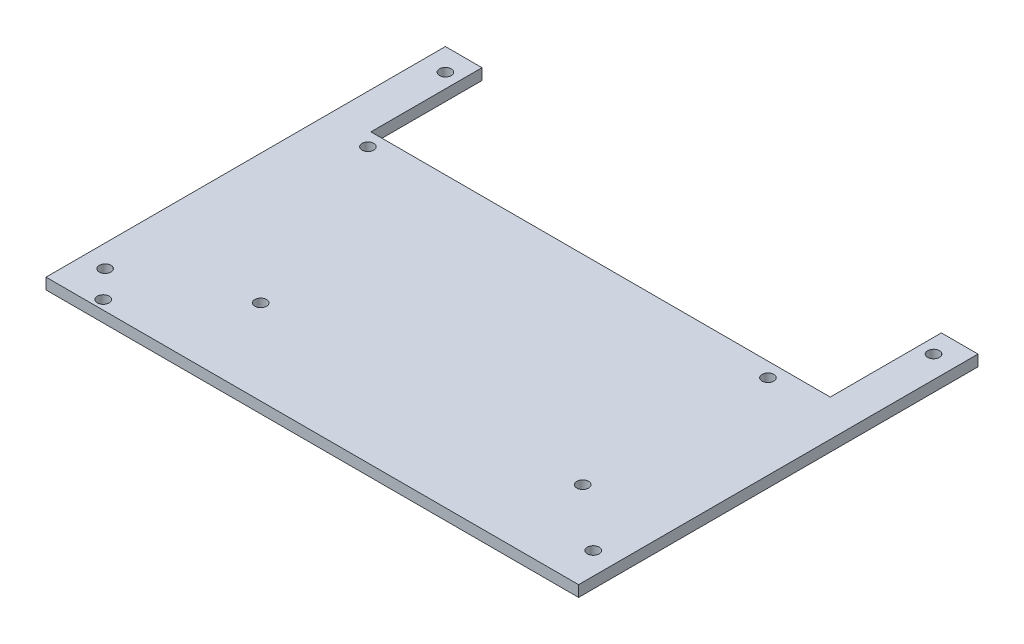
ISO-10303-21;
HEADER;
FILE_DESCRIPTION(('STEP AP214'),'2;1');
FILE_NAME('part.step','',(''),(''),'','','');
FILE_SCHEMA(('AUTOMOTIVE_DESIGN { 1 0 10303 214 1 1 1 1 }'));
ENDSEC;
DATA;
#1=APPLICATION_CONTEXT('core data for automotive mechanical design processes');
#2=APPLICATION_PROTOCOL_DEFINITION('international standard','automotive_design',2000,#1);
#3=PRODUCT_CONTEXT('',#1,'mechanical');
#4=PRODUCT('Part','Part','',(#3));
#5=PRODUCT_RELATED_PRODUCT_CATEGORY('part','',(#4));
#6=PRODUCT_DEFINITION_FORMATION('','',#4);
#7=PRODUCT_DEFINITION_CONTEXT('part definition',#1,'design');
#8=PRODUCT_DEFINITION('design','',#6,#7);
#9=PRODUCT_DEFINITION_SHAPE('','',#8);
#10=(LENGTH_UNIT() NAMED_UNIT(*) SI_UNIT(.MILLI.,.METRE.));
#11=(NAMED_UNIT(*) PLANE_ANGLE_UNIT() SI_UNIT($,.RADIAN.));
#12=(NAMED_UNIT(*) SI_UNIT($,.STERADIAN.) SOLID_ANGLE_UNIT());
#13=UNCERTAINTY_MEASURE_WITH_UNIT(LENGTH_MEASURE(1.E-05),#10,'distance_accuracy_value','');
#14=(GEOMETRIC_REPRESENTATION_CONTEXT(3) GLOBAL_UNCERTAINTY_ASSIGNED_CONTEXT((#13)) GLOBAL_UNIT_ASSIGNED_CONTEXT((#10,
#11,#12)) REPRESENTATION_CONTEXT('',''));
#15=CARTESIAN_POINT('',(0.,0.,0.));
#16=DIRECTION('',(0.,0.,1.));
#17=DIRECTION('',(1.,0.,0.));
#18=AXIS2_PLACEMENT_3D('',#15,#16,#17);
#19=CARTESIAN_POINT('',(-6.,-3.,-97.8583));
#20=DIRECTION('',(0.,0.,-1.));
#21=DIRECTION('',(-1.,0.,0.));
#22=AXIS2_PLACEMENT_3D('',#19,#20,#21);
#23=PLANE('',#22);
#24=DIRECTION('',(0.,1.,0.));
#25=VECTOR('',#24,1.);
#26=CARTESIAN_POINT('',(3.88760000000002,-130.577427470536,-97.8583));
#27=LINE('',#26,#25);
#28=CARTESIAN_POINT('',(3.88760000000002,-3.,-97.8583));
#29=VERTEX_POINT('',#28);
#30=CARTESIAN_POINT('',(3.88760000000002,0.,-97.8583));
#31=VERTEX_POINT('',#30);
#32=EDGE_CURVE('E114',#29,#31,#27,.T.);
#33=ORIENTED_EDGE('',*,*,#32,.F.);
#34=DIRECTION('',(-1.,0.,0.));
#35=VECTOR('',#34,1.);
#36=CARTESIAN_POINT('',(-6.,-3.,-97.8583));
#37=LINE('',#36,#35);
#38=CARTESIAN_POINT('',(-6.,-3.,-97.8583));
#39=VERTEX_POINT('',#38);
#40=EDGE_CURVE('E56',#29,#39,#37,.T.);
#41=ORIENTED_EDGE('',*,*,#40,.T.);
#42=DIRECTION('',(0.,1.,0.));
#43=VECTOR('',#42,1.);
#44=CARTESIAN_POINT('',(-6.,-3.,-97.8583));
#45=LINE('',#44,#43);
#46=CARTESIAN_POINT('',(-6.,0.,-97.8583));
#47=VERTEX_POINT('',#46);
#48=EDGE_CURVE('E11',#39,#47,#45,.T.);
#49=ORIENTED_EDGE('',*,*,#48,.T.);
#50=DIRECTION('',(-1.,0.,0.));
#51=VECTOR('',#50,1.);
#52=CARTESIAN_POINT('',(-6.,0.,-97.8583));
#53=LINE('',#52,#51);
#54=EDGE_CURVE('E79',#31,#47,#53,.T.);
#55=ORIENTED_EDGE('',*,*,#54,.F.);
#56=EDGE_LOOP('',(#33,#41,#49,#55));
#57=FACE_BOUND('',#56,.T.);
#58=ADVANCED_FACE('F31',(#57),#23,.T.);
#59=DIRECTION('',(0.,1.,0.));
#60=VECTOR('',#59,1.);
#61=CARTESIAN_POINT('',(127.8876,-130.577427470536,-97.8583));
#62=LINE('',#61,#60);
#63=CARTESIAN_POINT('',(127.8876,-3.,-97.8583));
#64=VERTEX_POINT('',#63);
#65=CARTESIAN_POINT('',(127.8876,0.,-97.8583));
#66=VERTEX_POINT('',#65);
#67=EDGE_CURVE('E260',#64,#66,#62,.T.);
#68=ORIENTED_EDGE('',*,*,#67,.T.);
#69=CARTESIAN_POINT('',(137.7752,0.,-97.8583));
#70=VERTEX_POINT('',#69);
#71=EDGE_CURVE('E140',#70,#66,#53,.T.);
#72=ORIENTED_EDGE('',*,*,#71,.F.);
#73=DIRECTION('',(0.,1.,0.));
#74=VECTOR('',#73,1.);
#75=CARTESIAN_POINT('',(137.7752,-3.,-97.8583));
#76=LINE('',#75,#74);
#77=CARTESIAN_POINT('',(137.7752,-3.,-97.8583));
#78=VERTEX_POINT('',#77);
#79=EDGE_CURVE('E40',#78,#70,#76,.T.);
#80=ORIENTED_EDGE('',*,*,#79,.F.);
#81=EDGE_CURVE('E123',#78,#64,#37,.T.);
#82=ORIENTED_EDGE('',*,*,#81,.T.);
#83=EDGE_LOOP('',(#68,#72,#80,#82));
#84=FACE_BOUND('',#83,.T.);
#85=ADVANCED_FACE('F156',(#84),#23,.T.);
#86=CARTESIAN_POINT('',(137.7752,-3.,6.));
#87=DIRECTION('',(1.,0.,0.));
#88=DIRECTION('',(0.,0.,-1.));
#89=AXIS2_PLACEMENT_3D('',#86,#87,#88);
#90=PLANE('',#89);
#91=DIRECTION('',(0.,0.,-1.));
#92=VECTOR('',#91,1.);
#93=CARTESIAN_POINT('',(137.7752,0.,6.));
#94=LINE('',#93,#92);
#95=CARTESIAN_POINT('',(137.7752,0.,9.96));
#96=VERTEX_POINT('',#95);
#97=EDGE_CURVE('E137',#96,#70,#94,.T.);
#98=ORIENTED_EDGE('',*,*,#97,.F.);
#99=DIRECTION('',(0.,1.,0.));
#100=VECTOR('',#99,1.);
#101=CARTESIAN_POINT('',(137.7752,-3.,9.96));
#102=LINE('',#101,#100);
#103=CARTESIAN_POINT('',(137.7752,-3.,9.96));
#104=VERTEX_POINT('',#103);
#105=EDGE_CURVE('E143',#104,#96,#102,.T.);
#106=ORIENTED_EDGE('',*,*,#105,.F.);
#107=DIRECTION('',(0.,0.,-1.));
#108=VECTOR('',#107,1.);
#109=CARTESIAN_POINT('',(137.7752,-3.,9.96));
#110=LINE('',#109,#108);
#111=EDGE_CURVE('E124',#104,#78,#110,.T.);
#112=ORIENTED_EDGE('',*,*,#111,.T.);
#113=ORIENTED_EDGE('',*,*,#79,.T.);
#114=EDGE_LOOP('',(#98,#106,#112,#113));
#115=FACE_BOUND('',#114,.T.);
#116=ADVANCED_FACE('F151',(#115),#90,.T.);
#117=CARTESIAN_POINT('',(131.7752,-3.,9.96));
#118=DIRECTION('',(0.,0.,1.));
#119=DIRECTION('',(1.,0.,0.));
#120=AXIS2_PLACEMENT_3D('',#117,#118,#119);
#121=PLANE('',#120);
#122=DIRECTION('',(1.,0.,0.));
#123=VECTOR('',#122,1.);
#124=CARTESIAN_POINT('',(131.7752,0.,9.96));
#125=LINE('',#124,#123);
#126=CARTESIAN_POINT('',(-6.,0.,9.96));
#127=VERTEX_POINT('',#126);
#128=EDGE_CURVE('E133',#127,#96,#125,.T.);
#129=ORIENTED_EDGE('',*,*,#128,.F.);
#130=DIRECTION('',(0.,1.,0.));
#131=VECTOR('',#130,1.);
#132=CARTESIAN_POINT('',(-6.,-3.,9.96));
#133=LINE('',#132,#131);
#134=CARTESIAN_POINT('',(-6.,-3.,9.96));
#135=VERTEX_POINT('',#134);
#136=EDGE_CURVE('E35',#135,#127,#133,.T.);
#137=ORIENTED_EDGE('',*,*,#136,.F.);
#138=DIRECTION('',(1.,0.,0.));
#139=VECTOR('',#138,1.);
#140=CARTESIAN_POINT('',(-6.,-3.,9.96));
#141=LINE('',#140,#139);
#142=EDGE_CURVE('E127',#135,#104,#141,.T.);
#143=ORIENTED_EDGE('',*,*,#142,.T.);
#144=ORIENTED_EDGE('',*,*,#105,.T.);
#145=EDGE_LOOP('',(#129,#137,#143,#144));
#146=FACE_BOUND('',#145,.T.);
#147=ADVANCED_FACE('F149',(#146),#121,.T.);
#148=CARTESIAN_POINT('',(-6.,-3.,6.));
#149=DIRECTION('',(-1.,0.,0.));
#150=DIRECTION('',(0.,0.,1.));
#151=AXIS2_PLACEMENT_3D('',#148,#149,#150);
#152=PLANE('',#151);
#153=DIRECTION('',(0.,0.,1.));
#154=VECTOR('',#153,1.);
#155=CARTESIAN_POINT('',(-6.,0.,6.));
#156=LINE('',#155,#154);
#157=EDGE_CURVE('E131',#47,#127,#156,.T.);
#158=ORIENTED_EDGE('',*,*,#157,.F.);
#159=ORIENTED_EDGE('',*,*,#48,.F.);
#160=DIRECTION('',(0.,0.,1.));
#161=VECTOR('',#160,1.);
#162=CARTESIAN_POINT('',(-6.,-3.,6.));
#163=LINE('',#162,#161);
#164=EDGE_CURVE('E86',#39,#135,#163,.T.);
#165=ORIENTED_EDGE('',*,*,#164,.T.);
#166=ORIENTED_EDGE('',*,*,#136,.T.);
#167=EDGE_LOOP('',(#158,#159,#165,#166));
#168=FACE_BOUND('',#167,.T.);
#169=ADVANCED_FACE('F33',(#168),#152,.T.);
#170=CARTESIAN_POINT('',(-6.,-3.,-97.8583));
#171=DIRECTION('',(0.,-1.,0.));
#172=DIRECTION('',(0.,0.,-1.));
#173=AXIS2_PLACEMENT_3D('',#170,#171,#172);
#174=PLANE('',#173);
#175=CARTESIAN_POINT('',(29.,-3.,-13.));
#176=DIRECTION('',(0.,-1.,0.));
#177=DIRECTION('',(0.,0.,-1.));
#178=AXIS2_PLACEMENT_3D('',#175,#176,#177);
#179=CIRCLE('',#178,1.59);
#180=CARTESIAN_POINT('',(29.,-3.,-14.59));
#181=VERTEX_POINT('',#180);
#182=EDGE_CURVE('E224',#181,#181,#179,.F.);
#183=ORIENTED_EDGE('',*,*,#182,.T.);
#184=EDGE_LOOP('',(#183));
#185=FACE_BOUND('',#184,.T.);
#186=CARTESIAN_POINT('',(114.964029329623,-3.,-13.9562533200031));
#187=DIRECTION('',(0.,-1.,0.));
#188=DIRECTION('',(0.,0.,-1.));
#189=AXIS2_PLACEMENT_3D('',#186,#187,#188);
#190=CIRCLE('',#189,1.58999999999999);
#191=CARTESIAN_POINT('',(114.964029329623,-3.,-15.5462533200031));
#192=VERTEX_POINT('',#191);
#193=EDGE_CURVE('E228',#192,#192,#190,.F.);
#194=ORIENTED_EDGE('',*,*,#193,.T.);
#195=EDGE_LOOP('',(#194));
#196=FACE_BOUND('',#195,.T.);
#197=CARTESIAN_POINT('',(114.970465448364,-3.,-63.9562545057669));
#198=DIRECTION('',(0.,-1.,0.));
#199=DIRECTION('',(0.,0.,-1.));
#200=AXIS2_PLACEMENT_3D('',#197,#198,#199);
#201=CIRCLE('',#200,1.59);
#202=CARTESIAN_POINT('',(114.970465448364,-3.,-65.5462545057668));
#203=VERTEX_POINT('',#202);
#204=EDGE_CURVE('E237',#203,#203,#201,.F.);
#205=ORIENTED_EDGE('',*,*,#204,.T.);
#206=EDGE_LOOP('',(#205));
#207=FACE_BOUND('',#206,.T.);
#208=CARTESIAN_POINT('',(6.97046644311455,-3.,-63.9701565217896));
#209=DIRECTION('',(0.,-1.,0.));
#210=DIRECTION('',(0.,0.,-1.));
#211=AXIS2_PLACEMENT_3D('',#208,#209,#210);
#212=CIRCLE('',#211,1.59);
#213=CARTESIAN_POINT('',(6.97046644311455,-3.,-65.5601565217896));
#214=VERTEX_POINT('',#213);
#215=EDGE_CURVE('E243',#214,#214,#212,.F.);
#216=ORIENTED_EDGE('',*,*,#215,.T.);
#217=EDGE_LOOP('',(#216));
#218=FACE_BOUND('',#217,.T.);
#219=CARTESIAN_POINT('',(6.96127064552733,-3.,7.46884402635795));
#220=DIRECTION('',(0.,-1.,0.));
#221=DIRECTION('',(0.,0.,-1.));
#222=AXIS2_PLACEMENT_3D('',#219,#220,#221);
#223=CIRCLE('',#222,1.59);
#224=CARTESIAN_POINT('',(6.96127064552733,-3.,5.87884402635795));
#225=VERTEX_POINT('',#224);
#226=EDGE_CURVE('E249',#225,#225,#223,.F.);
#227=ORIENTED_EDGE('',*,*,#226,.T.);
#228=EDGE_LOOP('',(#227));
#229=FACE_BOUND('',#228,.T.);
#230=DIRECTION('',(0.,0.,1.));
#231=VECTOR('',#230,1.);
#232=CARTESIAN_POINT('',(3.88760000000002,-3.,-97.8583));
#233=LINE('',#232,#231);
#234=CARTESIAN_POINT('',(3.88760000000002,-3.,-67.8583));
#235=VERTEX_POINT('',#234);
#236=EDGE_CURVE('E111',#29,#235,#233,.T.);
#237=ORIENTED_EDGE('',*,*,#236,.T.);
#238=DIRECTION('',(1.,0.,0.));
#239=VECTOR('',#238,1.);
#240=CARTESIAN_POINT('',(127.8876,-3.,-67.8583));
#241=LINE('',#240,#239);
#242=CARTESIAN_POINT('',(127.8876,-3.,-67.8583));
#243=VERTEX_POINT('',#242);
#244=EDGE_CURVE('E262',#235,#243,#241,.T.);
#245=ORIENTED_EDGE('',*,*,#244,.T.);
#246=DIRECTION('',(0.,0.,-1.));
#247=VECTOR('',#246,1.);
#248=CARTESIAN_POINT('',(127.8876,-3.,-97.8583));
#249=LINE('',#248,#247);
#250=EDGE_CURVE('E257',#243,#64,#249,.T.);
#251=ORIENTED_EDGE('',*,*,#250,.T.);
#252=ORIENTED_EDGE('',*,*,#81,.F.);
#253=ORIENTED_EDGE('',*,*,#111,.F.);
#254=ORIENTED_EDGE('',*,*,#142,.F.);
#255=ORIENTED_EDGE('',*,*,#164,.F.);
#256=ORIENTED_EDGE('',*,*,#40,.F.);
#257=EDGE_LOOP('',(#237,#245,#251,#252,#253,#254,#255,#256));
#258=FACE_BOUND('',#257,.T.);
#259=CARTESIAN_POINT('',(0.,-3.,0.));
#260=DIRECTION('',(0.,1.,0.));
#261=DIRECTION('',(0.,0.,1.));
#262=AXIS2_PLACEMENT_3D('',#259,#260,#261);
#263=CIRCLE('',#262,1.59);
#264=CARTESIAN_POINT('',(0.,-3.,1.59));
#265=VERTEX_POINT('',#264);
#266=EDGE_CURVE('E269',#265,#265,#263,.T.);
#267=ORIENTED_EDGE('',*,*,#266,.T.);
#268=EDGE_LOOP('',(#267));
#269=FACE_BOUND('',#268,.T.);
#270=CARTESIAN_POINT('',(131.7752,-3.,0.));
#271=DIRECTION('',(0.,1.,0.));
#272=DIRECTION('',(0.,0.,1.));
#273=AXIS2_PLACEMENT_3D('',#270,#271,#272);
#274=CIRCLE('',#273,1.59000000000001);
#275=CARTESIAN_POINT('',(131.7752,-3.,1.59000000000001));
#276=VERTEX_POINT('',#275);
#277=EDGE_CURVE('E275',#276,#276,#274,.T.);
#278=ORIENTED_EDGE('',*,*,#277,.T.);
#279=EDGE_LOOP('',(#278));
#280=FACE_BOUND('',#279,.T.);
#281=CARTESIAN_POINT('',(131.7752,-3.,-91.8583));
#282=DIRECTION('',(0.,1.,0.));
#283=DIRECTION('',(0.,0.,1.));
#284=AXIS2_PLACEMENT_3D('',#281,#282,#283);
#285=CIRCLE('',#284,1.59000000000001);
#286=CARTESIAN_POINT('',(131.7752,-3.,-90.2683));
#287=VERTEX_POINT('',#286);
#288=EDGE_CURVE('E281',#287,#287,#285,.T.);
#289=ORIENTED_EDGE('',*,*,#288,.T.);
#290=EDGE_LOOP('',(#289));
#291=FACE_BOUND('',#290,.T.);
#292=CARTESIAN_POINT('',(0.,-3.,-91.8583));
#293=DIRECTION('',(0.,1.,0.));
#294=DIRECTION('',(0.,0.,1.));
#295=AXIS2_PLACEMENT_3D('',#292,#293,#294);
#296=CIRCLE('',#295,1.59);
#297=CARTESIAN_POINT('',(0.,-3.,-90.2683));
#298=VERTEX_POINT('',#297);
#299=EDGE_CURVE('E134',#298,#298,#296,.T.);
#300=ORIENTED_EDGE('',*,*,#299,.T.);
#301=EDGE_LOOP('',(#300));
#302=FACE_BOUND('',#301,.T.);
#303=ADVANCED_FACE('F120',(#185,#196,#207,#218,#229,#258,#269,#280,#291,#302),#174,.T.);
#304=CARTESIAN_POINT('',(-6.,0.,-97.8583));
#305=DIRECTION('',(0.,-1.,0.));
#306=DIRECTION('',(0.,0.,-1.));
#307=AXIS2_PLACEMENT_3D('',#304,#305,#306);
#308=PLANE('',#307);
#309=CARTESIAN_POINT('',(29.,0.,-13.));
#310=DIRECTION('',(0.,1.,0.));
#311=DIRECTION('',(0.,0.,1.));
#312=AXIS2_PLACEMENT_3D('',#309,#310,#311);
#313=CIRCLE('',#312,1.59);
#314=CARTESIAN_POINT('',(29.,0.,-11.41));
#315=VERTEX_POINT('',#314);
#316=EDGE_CURVE('E221',#315,#315,#313,.T.);
#317=ORIENTED_EDGE('',*,*,#316,.F.);
#318=EDGE_LOOP('',(#317));
#319=FACE_BOUND('',#318,.T.);
#320=CARTESIAN_POINT('',(114.964029329623,0.,-13.9562533200031));
#321=DIRECTION('',(0.,1.,0.));
#322=DIRECTION('',(0.,0.,1.));
#323=AXIS2_PLACEMENT_3D('',#320,#321,#322);
#324=CIRCLE('',#323,1.58999999999999);
#325=CARTESIAN_POINT('',(114.964029329623,0.,-12.3662533200031));
#326=VERTEX_POINT('',#325);
#327=EDGE_CURVE('E225',#326,#326,#324,.T.);
#328=ORIENTED_EDGE('',*,*,#327,.F.);
#329=EDGE_LOOP('',(#328));
#330=FACE_BOUND('',#329,.T.);
#331=CARTESIAN_POINT('',(114.970465448364,0.,-63.9562545057669));
#332=DIRECTION('',(0.,1.,0.));
#333=DIRECTION('',(0.,0.,1.));
#334=AXIS2_PLACEMENT_3D('',#331,#332,#333);
#335=CIRCLE('',#334,1.59);
#336=CARTESIAN_POINT('',(114.970465448364,0.,-62.3662545057669));
#337=VERTEX_POINT('',#336);
#338=EDGE_CURVE('E234',#337,#337,#335,.T.);
#339=ORIENTED_EDGE('',*,*,#338,.F.);
#340=EDGE_LOOP('',(#339));
#341=FACE_BOUND('',#340,.T.);
#342=CARTESIAN_POINT('',(6.97046644311455,0.,-63.9701565217896));
#343=DIRECTION('',(0.,1.,0.));
#344=DIRECTION('',(0.,0.,1.));
#345=AXIS2_PLACEMENT_3D('',#342,#343,#344);
#346=CIRCLE('',#345,1.59);
#347=CARTESIAN_POINT('',(6.97046644311455,0.,-62.3801565217896));
#348=VERTEX_POINT('',#347);
#349=EDGE_CURVE('E240',#348,#348,#346,.T.);
#350=ORIENTED_EDGE('',*,*,#349,.F.);
#351=EDGE_LOOP('',(#350));
#352=FACE_BOUND('',#351,.T.);
#353=CARTESIAN_POINT('',(6.96127064552733,0.,7.46884402635795));
#354=DIRECTION('',(0.,1.,0.));
#355=DIRECTION('',(0.,0.,1.));
#356=AXIS2_PLACEMENT_3D('',#353,#354,#355);
#357=CIRCLE('',#356,1.59);
#358=CARTESIAN_POINT('',(6.96127064552733,0.,9.05884402635795));
#359=VERTEX_POINT('',#358);
#360=EDGE_CURVE('E246',#359,#359,#357,.T.);
#361=ORIENTED_EDGE('',*,*,#360,.F.);
#362=EDGE_LOOP('',(#361));
#363=FACE_BOUND('',#362,.T.);
#364=CARTESIAN_POINT('',(0.,0.,0.));
#365=DIRECTION('',(0.,1.,0.));
#366=DIRECTION('',(0.,0.,1.));
#367=AXIS2_PLACEMENT_3D('',#364,#365,#366);
#368=CIRCLE('',#367,1.59);
#369=CARTESIAN_POINT('',(0.,0.,1.59));
#370=VERTEX_POINT('',#369);
#371=EDGE_CURVE('E268',#370,#370,#368,.T.);
#372=ORIENTED_EDGE('',*,*,#371,.F.);
#373=EDGE_LOOP('',(#372));
#374=FACE_BOUND('',#373,.T.);
#375=CARTESIAN_POINT('',(131.7752,0.,0.));
#376=DIRECTION('',(0.,1.,0.));
#377=DIRECTION('',(0.,0.,1.));
#378=AXIS2_PLACEMENT_3D('',#375,#376,#377);
#379=CIRCLE('',#378,1.59000000000001);
#380=CARTESIAN_POINT('',(131.7752,0.,1.59000000000001));
#381=VERTEX_POINT('',#380);
#382=EDGE_CURVE('E272',#381,#381,#379,.T.);
#383=ORIENTED_EDGE('',*,*,#382,.F.);
#384=EDGE_LOOP('',(#383));
#385=FACE_BOUND('',#384,.T.);
#386=CARTESIAN_POINT('',(131.7752,0.,-91.8583));
#387=DIRECTION('',(0.,1.,0.));
#388=DIRECTION('',(0.,0.,1.));
#389=AXIS2_PLACEMENT_3D('',#386,#387,#388);
#390=CIRCLE('',#389,1.59000000000001);
#391=CARTESIAN_POINT('',(131.7752,0.,-90.2683));
#392=VERTEX_POINT('',#391);
#393=EDGE_CURVE('E278',#392,#392,#390,.T.);
#394=ORIENTED_EDGE('',*,*,#393,.F.);
#395=EDGE_LOOP('',(#394));
#396=FACE_BOUND('',#395,.T.);
#397=CARTESIAN_POINT('',(0.,0.,-91.8583));
#398=DIRECTION('',(0.,1.,0.));
#399=DIRECTION('',(0.,0.,1.));
#400=AXIS2_PLACEMENT_3D('',#397,#398,#399);
#401=CIRCLE('',#400,1.59);
#402=CARTESIAN_POINT('',(0.,0.,-90.2683));
#403=VERTEX_POINT('',#402);
#404=EDGE_CURVE('E284',#403,#403,#401,.T.);
#405=ORIENTED_EDGE('',*,*,#404,.F.);
#406=EDGE_LOOP('',(#405));
#407=FACE_BOUND('',#406,.T.);
#408=DIRECTION('',(1.,0.,0.));
#409=VECTOR('',#408,1.);
#410=CARTESIAN_POINT('',(127.8876,0.,-67.8583));
#411=LINE('',#410,#409);
#412=CARTESIAN_POINT('',(3.88760000000002,0.,-67.8583));
#413=VERTEX_POINT('',#412);
#414=CARTESIAN_POINT('',(127.8876,0.,-67.8583));
#415=VERTEX_POINT('',#414);
#416=EDGE_CURVE('E48',#413,#415,#411,.T.);
#417=ORIENTED_EDGE('',*,*,#416,.F.);
#418=DIRECTION('',(0.,0.,1.));
#419=VECTOR('',#418,1.);
#420=CARTESIAN_POINT('',(3.88760000000002,0.,-97.8583));
#421=LINE('',#420,#419);
#422=EDGE_CURVE('E254',#31,#413,#421,.T.);
#423=ORIENTED_EDGE('',*,*,#422,.F.);
#424=ORIENTED_EDGE('',*,*,#54,.T.);
#425=ORIENTED_EDGE('',*,*,#157,.T.);
#426=ORIENTED_EDGE('',*,*,#128,.T.);
#427=ORIENTED_EDGE('',*,*,#97,.T.);
#428=ORIENTED_EDGE('',*,*,#71,.T.);
#429=DIRECTION('',(0.,0.,-1.));
#430=VECTOR('',#429,1.);
#431=CARTESIAN_POINT('',(127.8876,0.,-97.8583));
#432=LINE('',#431,#430);
#433=EDGE_CURVE('E252',#415,#66,#432,.T.);
#434=ORIENTED_EDGE('',*,*,#433,.F.);
#435=EDGE_LOOP('',(#417,#423,#424,#425,#426,#427,#428,#434));
#436=FACE_BOUND('',#435,.T.);
#437=ADVANCED_FACE('F147',(#319,#330,#341,#352,#363,#374,#385,#396,#407,#436),#308,.F.);
#438=CARTESIAN_POINT('',(0.,-3.,-91.8583));
#439=DIRECTION('',(0.,1.,0.));
#440=DIRECTION('',(0.,0.,1.));
#441=AXIS2_PLACEMENT_3D('',#438,#439,#440);
#442=CYLINDRICAL_SURFACE('',#441,1.59);
#443=ORIENTED_EDGE('',*,*,#299,.F.);
#444=EDGE_LOOP('',(#443));
#445=FACE_BOUND('',#444,.T.);
#446=ORIENTED_EDGE('',*,*,#404,.T.);
#447=EDGE_LOOP('',(#446));
#448=FACE_BOUND('',#447,.T.);
#449=ADVANCED_FACE('F168',(#445,#448),#442,.F.);
#450=CARTESIAN_POINT('',(131.7752,-3.,-91.8583));
#451=DIRECTION('',(0.,1.,0.));
#452=DIRECTION('',(0.,0.,1.));
#453=AXIS2_PLACEMENT_3D('',#450,#451,#452);
#454=CYLINDRICAL_SURFACE('',#453,1.59000000000001);
#455=ORIENTED_EDGE('',*,*,#288,.F.);
#456=EDGE_LOOP('',(#455));
#457=FACE_BOUND('',#456,.T.);
#458=ORIENTED_EDGE('',*,*,#393,.T.);
#459=EDGE_LOOP('',(#458));
#460=FACE_BOUND('',#459,.T.);
#461=ADVANCED_FACE('F175',(#457,#460),#454,.F.);
#462=CARTESIAN_POINT('',(131.7752,-3.,0.));
#463=DIRECTION('',(0.,1.,0.));
#464=DIRECTION('',(0.,0.,1.));
#465=AXIS2_PLACEMENT_3D('',#462,#463,#464);
#466=CYLINDRICAL_SURFACE('',#465,1.59000000000001);
#467=ORIENTED_EDGE('',*,*,#277,.F.);
#468=EDGE_LOOP('',(#467));
#469=FACE_BOUND('',#468,.T.);
#470=ORIENTED_EDGE('',*,*,#382,.T.);
#471=EDGE_LOOP('',(#470));
#472=FACE_BOUND('',#471,.T.);
#473=ADVANCED_FACE('F179',(#469,#472),#466,.F.);
#474=CARTESIAN_POINT('',(0.,-3.,0.));
#475=DIRECTION('',(0.,1.,0.));
#476=DIRECTION('',(0.,0.,1.));
#477=AXIS2_PLACEMENT_3D('',#474,#475,#476);
#478=CYLINDRICAL_SURFACE('',#477,1.59);
#479=ORIENTED_EDGE('',*,*,#266,.F.);
#480=EDGE_LOOP('',(#479));
#481=FACE_BOUND('',#480,.T.);
#482=ORIENTED_EDGE('',*,*,#371,.T.);
#483=EDGE_LOOP('',(#482));
#484=FACE_BOUND('',#483,.T.);
#485=ADVANCED_FACE('F183',(#481,#484),#478,.F.);
#486=CARTESIAN_POINT('',(3.88760000000002,-130.577427470536,-97.8583));
#487=DIRECTION('',(-1.,0.,0.));
#488=DIRECTION('',(0.,0.,1.));
#489=AXIS2_PLACEMENT_3D('',#486,#487,#488);
#490=PLANE('',#489);
#491=ORIENTED_EDGE('',*,*,#32,.T.);
#492=ORIENTED_EDGE('',*,*,#422,.T.);
#493=DIRECTION('',(0.,1.,0.));
#494=VECTOR('',#493,1.);
#495=CARTESIAN_POINT('',(3.88760000000002,-130.577427470536,-67.8583));
#496=LINE('',#495,#494);
#497=EDGE_CURVE('E115',#235,#413,#496,.T.);
#498=ORIENTED_EDGE('',*,*,#497,.F.);
#499=ORIENTED_EDGE('',*,*,#236,.F.);
#500=EDGE_LOOP('',(#491,#492,#498,#499));
#501=FACE_BOUND('',#500,.T.);
#502=ADVANCED_FACE('F112',(#501),#490,.F.);
#503=CARTESIAN_POINT('',(127.8876,-130.577427470536,-67.8583));
#504=DIRECTION('',(0.,0.,1.));
#505=DIRECTION('',(1.,0.,0.));
#506=AXIS2_PLACEMENT_3D('',#503,#504,#505);
#507=PLANE('',#506);
#508=ORIENTED_EDGE('',*,*,#497,.T.);
#509=ORIENTED_EDGE('',*,*,#416,.T.);
#510=DIRECTION('',(0.,1.,0.));
#511=VECTOR('',#510,1.);
#512=CARTESIAN_POINT('',(127.8876,-130.577427470536,-67.8583));
#513=LINE('',#512,#511);
#514=EDGE_CURVE('E261',#243,#415,#513,.T.);
#515=ORIENTED_EDGE('',*,*,#514,.F.);
#516=ORIENTED_EDGE('',*,*,#244,.F.);
#517=EDGE_LOOP('',(#508,#509,#515,#516));
#518=FACE_BOUND('',#517,.T.);
#519=ADVANCED_FACE('F190',(#518),#507,.F.);
#520=CARTESIAN_POINT('',(127.8876,-130.577427470536,-97.8583));
#521=DIRECTION('',(1.,0.,0.));
#522=DIRECTION('',(0.,0.,-1.));
#523=AXIS2_PLACEMENT_3D('',#520,#521,#522);
#524=PLANE('',#523);
#525=ORIENTED_EDGE('',*,*,#514,.T.);
#526=ORIENTED_EDGE('',*,*,#433,.T.);
#527=ORIENTED_EDGE('',*,*,#67,.F.);
#528=ORIENTED_EDGE('',*,*,#250,.F.);
#529=EDGE_LOOP('',(#525,#526,#527,#528));
#530=FACE_BOUND('',#529,.T.);
#531=ADVANCED_FACE('F193',(#530),#524,.F.);
#532=CARTESIAN_POINT('',(6.96127064552733,-7.49719912834645,7.46884402635795));
#533=DIRECTION('',(0.,1.,0.));
#534=DIRECTION('',(0.,0.,1.));
#535=AXIS2_PLACEMENT_3D('',#532,#533,#534);
#536=CYLINDRICAL_SURFACE('',#535,1.59);
#537=ORIENTED_EDGE('',*,*,#360,.T.);
#538=EDGE_LOOP('',(#537));
#539=FACE_BOUND('',#538,.T.);
#540=ORIENTED_EDGE('',*,*,#226,.F.);
#541=EDGE_LOOP('',(#540));
#542=FACE_BOUND('',#541,.T.);
#543=ADVANCED_FACE('F196',(#539,#542),#536,.F.);
#544=CARTESIAN_POINT('',(6.97046644311455,-7.49719912834645,-63.9701565217896));
#545=DIRECTION('',(0.,1.,0.));
#546=DIRECTION('',(0.,0.,1.));
#547=AXIS2_PLACEMENT_3D('',#544,#545,#546);
#548=CYLINDRICAL_SURFACE('',#547,1.59);
#549=ORIENTED_EDGE('',*,*,#349,.T.);
#550=EDGE_LOOP('',(#549));
#551=FACE_BOUND('',#550,.T.);
#552=ORIENTED_EDGE('',*,*,#215,.F.);
#553=EDGE_LOOP('',(#552));
#554=FACE_BOUND('',#553,.T.);
#555=ADVANCED_FACE('F200',(#551,#554),#548,.F.);
#556=CARTESIAN_POINT('',(114.970465448364,-7.49719912834645,-63.9562545057669));
#557=DIRECTION('',(0.,1.,0.));
#558=DIRECTION('',(0.,0.,1.));
#559=AXIS2_PLACEMENT_3D('',#556,#557,#558);
#560=CYLINDRICAL_SURFACE('',#559,1.59);
#561=ORIENTED_EDGE('',*,*,#338,.T.);
#562=EDGE_LOOP('',(#561));
#563=FACE_BOUND('',#562,.T.);
#564=ORIENTED_EDGE('',*,*,#204,.F.);
#565=EDGE_LOOP('',(#564));
#566=FACE_BOUND('',#565,.T.);
#567=ADVANCED_FACE('F204',(#563,#566),#560,.F.);
#568=CARTESIAN_POINT('',(114.964029329623,-7.49719912834645,-13.9562533200031));
#569=DIRECTION('',(0.,1.,0.));
#570=DIRECTION('',(0.,0.,1.));
#571=AXIS2_PLACEMENT_3D('',#568,#569,#570);
#572=CYLINDRICAL_SURFACE('',#571,1.58999999999999);
#573=ORIENTED_EDGE('',*,*,#327,.T.);
#574=EDGE_LOOP('',(#573));
#575=FACE_BOUND('',#574,.T.);
#576=ORIENTED_EDGE('',*,*,#193,.F.);
#577=EDGE_LOOP('',(#576));
#578=FACE_BOUND('',#577,.T.);
#579=ADVANCED_FACE('F208',(#575,#578),#572,.F.);
#580=CARTESIAN_POINT('',(29.,-7.49719912834645,-13.));
#581=DIRECTION('',(0.,1.,0.));
#582=DIRECTION('',(0.,0.,1.));
#583=AXIS2_PLACEMENT_3D('',#580,#581,#582);
#584=CYLINDRICAL_SURFACE('',#583,1.59);
#585=ORIENTED_EDGE('',*,*,#316,.T.);
#586=EDGE_LOOP('',(#585));
#587=FACE_BOUND('',#586,.T.);
#588=ORIENTED_EDGE('',*,*,#182,.F.);
#589=EDGE_LOOP('',(#588));
#590=FACE_BOUND('',#589,.T.);
#591=ADVANCED_FACE('F212',(#587,#590),#584,.F.);
#592=CLOSED_SHELL('',(#58,#85,#116,#147,#169,#303,#437,#449,#461,#473,#485,#502,#519,#531,#543,
#555,#567,#579,#591));
#593=MANIFOLD_SOLID_BREP('B2',#592);
#594=ADVANCED_BREP_SHAPE_REPRESENTATION('',(#18,#593),#14);
#595=SHAPE_DEFINITION_REPRESENTATION(#9,#594);
ENDSEC;
END-ISO-10303-21;
